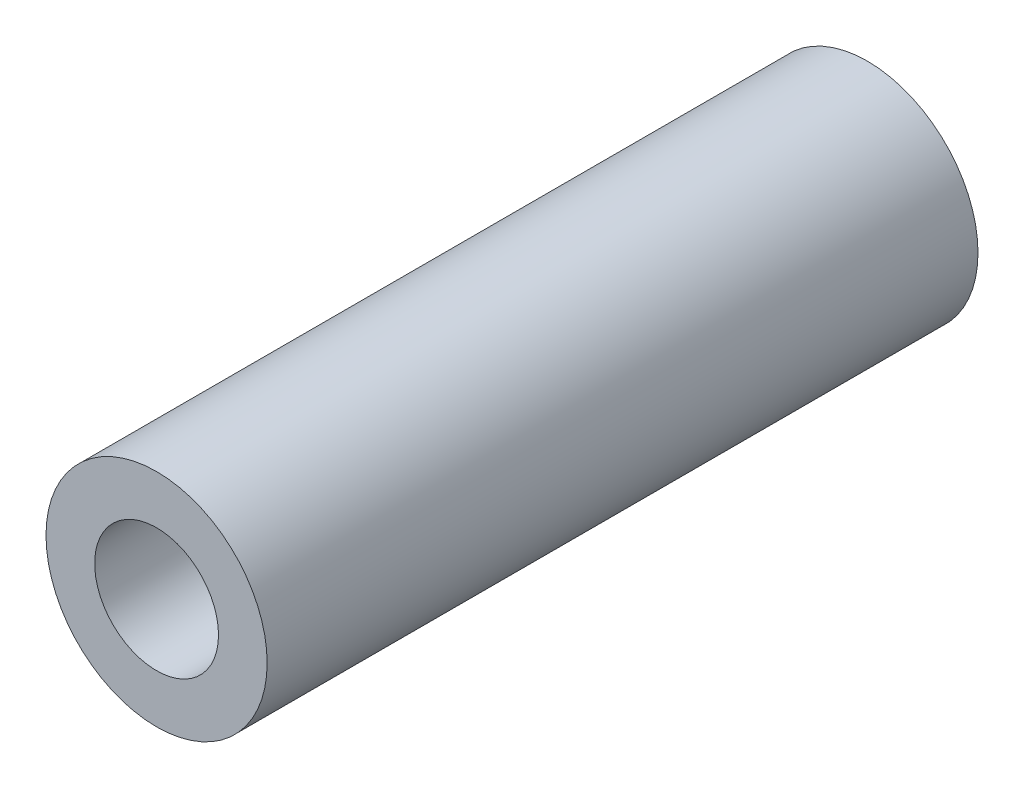
ISO-10303-21;
HEADER;
FILE_DESCRIPTION(('STEP AP214'),'2;1');
FILE_NAME('part.step','',(''),(''),'','','');
FILE_SCHEMA(('AUTOMOTIVE_DESIGN { 1 0 10303 214 1 1 1 1 }'));
ENDSEC;
DATA;
#1=APPLICATION_CONTEXT('core data for automotive mechanical design processes');
#2=APPLICATION_PROTOCOL_DEFINITION('international standard','automotive_design',2000,#1);
#3=PRODUCT_CONTEXT('',#1,'mechanical');
#4=PRODUCT('Part','Part','',(#3));
#5=PRODUCT_RELATED_PRODUCT_CATEGORY('part','',(#4));
#6=PRODUCT_DEFINITION_FORMATION('','',#4);
#7=PRODUCT_DEFINITION_CONTEXT('part definition',#1,'design');
#8=PRODUCT_DEFINITION('design','',#6,#7);
#9=PRODUCT_DEFINITION_SHAPE('','',#8);
#10=(LENGTH_UNIT() NAMED_UNIT(*) SI_UNIT(.MILLI.,.METRE.));
#11=(NAMED_UNIT(*) PLANE_ANGLE_UNIT() SI_UNIT($,.RADIAN.));
#12=(NAMED_UNIT(*) SI_UNIT($,.STERADIAN.) SOLID_ANGLE_UNIT());
#13=UNCERTAINTY_MEASURE_WITH_UNIT(LENGTH_MEASURE(1.E-05),#10,'distance_accuracy_value','');
#14=(GEOMETRIC_REPRESENTATION_CONTEXT(3) GLOBAL_UNCERTAINTY_ASSIGNED_CONTEXT((#13)) GLOBAL_UNIT_ASSIGNED_CONTEXT((#10,
#11,#12)) REPRESENTATION_CONTEXT('',''));
#15=CARTESIAN_POINT('',(0.,0.,0.));
#16=DIRECTION('',(0.,0.,1.));
#17=DIRECTION('',(1.,0.,0.));
#18=AXIS2_PLACEMENT_3D('',#15,#16,#17);
#19=CARTESIAN_POINT('',(0.,4.445,14.2875));
#20=DIRECTION('',(0.,0.,-1.));
#21=DIRECTION('',(-1.,0.,0.));
#22=AXIS2_PLACEMENT_3D('',#19,#20,#21);
#23=PLANE('',#22);
#24=CARTESIAN_POINT('',(0.,0.,14.2875));
#25=DIRECTION('',(0.,0.,1.));
#26=DIRECTION('',(1.,0.,0.));
#27=AXIS2_PLACEMENT_3D('',#24,#25,#26);
#28=CIRCLE('',#27,2.4892);
#29=CARTESIAN_POINT('',(2.4892,0.,14.2875));
#30=VERTEX_POINT('',#29);
#31=EDGE_CURVE('E10',#30,#30,#28,.T.);
#32=ORIENTED_EDGE('',*,*,#31,.F.);
#33=EDGE_LOOP('',(#32));
#34=FACE_BOUND('',#33,.T.);
#35=CARTESIAN_POINT('',(0.,0.,14.2875));
#36=DIRECTION('',(0.,0.,1.));
#37=DIRECTION('',(1.,0.,0.));
#38=AXIS2_PLACEMENT_3D('',#35,#36,#37);
#39=CIRCLE('',#38,4.445);
#40=CARTESIAN_POINT('',(4.445,0.,14.2875));
#41=VERTEX_POINT('',#40);
#42=EDGE_CURVE('E49',#41,#41,#39,.T.);
#43=ORIENTED_EDGE('',*,*,#42,.T.);
#44=EDGE_LOOP('',(#43));
#45=FACE_BOUND('',#44,.T.);
#46=ADVANCED_FACE('F35',(#34,#45),#23,.F.);
#47=CARTESIAN_POINT('',(0.,0.,43.4651844186562));
#48=DIRECTION('',(0.,0.,1.));
#49=DIRECTION('',(1.,0.,0.));
#50=AXIS2_PLACEMENT_3D('',#47,#48,#49);
#51=CYLINDRICAL_SURFACE('',#50,2.4892);
#52=CARTESIAN_POINT('',(0.,0.,-14.2875));
#53=DIRECTION('',(0.,0.,1.));
#54=DIRECTION('',(1.,0.,0.));
#55=AXIS2_PLACEMENT_3D('',#52,#53,#54);
#56=CIRCLE('',#55,2.4892);
#57=CARTESIAN_POINT('',(2.4892,0.,-14.2875));
#58=VERTEX_POINT('',#57);
#59=EDGE_CURVE('E41',#58,#58,#56,.T.);
#60=ORIENTED_EDGE('',*,*,#59,.F.);
#61=EDGE_LOOP('',(#60));
#62=FACE_BOUND('',#61,.T.);
#63=ORIENTED_EDGE('',*,*,#31,.T.);
#64=EDGE_LOOP('',(#63));
#65=FACE_BOUND('',#64,.T.);
#66=ADVANCED_FACE('F64',(#62,#65),#51,.F.);
#67=CARTESIAN_POINT('',(0.,4.445,-14.2875));
#68=DIRECTION('',(0.,0.,1.));
#69=DIRECTION('',(1.,0.,0.));
#70=AXIS2_PLACEMENT_3D('',#67,#68,#69);
#71=PLANE('',#70);
#72=CARTESIAN_POINT('',(0.,0.,-14.2875));
#73=DIRECTION('',(0.,0.,1.));
#74=DIRECTION('',(1.,0.,0.));
#75=AXIS2_PLACEMENT_3D('',#72,#73,#74);
#76=CIRCLE('',#75,4.445);
#77=CARTESIAN_POINT('',(4.445,0.,-14.2875));
#78=VERTEX_POINT('',#77);
#79=EDGE_CURVE('E45',#78,#78,#76,.T.);
#80=ORIENTED_EDGE('',*,*,#79,.F.);
#81=EDGE_LOOP('',(#80));
#82=FACE_BOUND('',#81,.T.);
#83=ORIENTED_EDGE('',*,*,#59,.T.);
#84=EDGE_LOOP('',(#83));
#85=FACE_BOUND('',#84,.T.);
#86=ADVANCED_FACE('F59',(#82,#85),#71,.F.);
#87=CARTESIAN_POINT('',(0.,0.,43.4651844186562));
#88=DIRECTION('',(0.,0.,1.));
#89=DIRECTION('',(1.,0.,0.));
#90=AXIS2_PLACEMENT_3D('',#87,#88,#89);
#91=CYLINDRICAL_SURFACE('',#90,4.445);
#92=ORIENTED_EDGE('',*,*,#42,.F.);
#93=EDGE_LOOP('',(#92));
#94=FACE_BOUND('',#93,.T.);
#95=ORIENTED_EDGE('',*,*,#79,.T.);
#96=EDGE_LOOP('',(#95));
#97=FACE_BOUND('',#96,.T.);
#98=ADVANCED_FACE('F56',(#94,#97),#91,.T.);
#99=CLOSED_SHELL('',(#46,#66,#86,#98));
#100=MANIFOLD_SOLID_BREP('B2',#99);
#101=ADVANCED_BREP_SHAPE_REPRESENTATION('',(#18,#100),#14);
#102=SHAPE_DEFINITION_REPRESENTATION(#9,#101);
ENDSEC;
END-ISO-10303-21;
